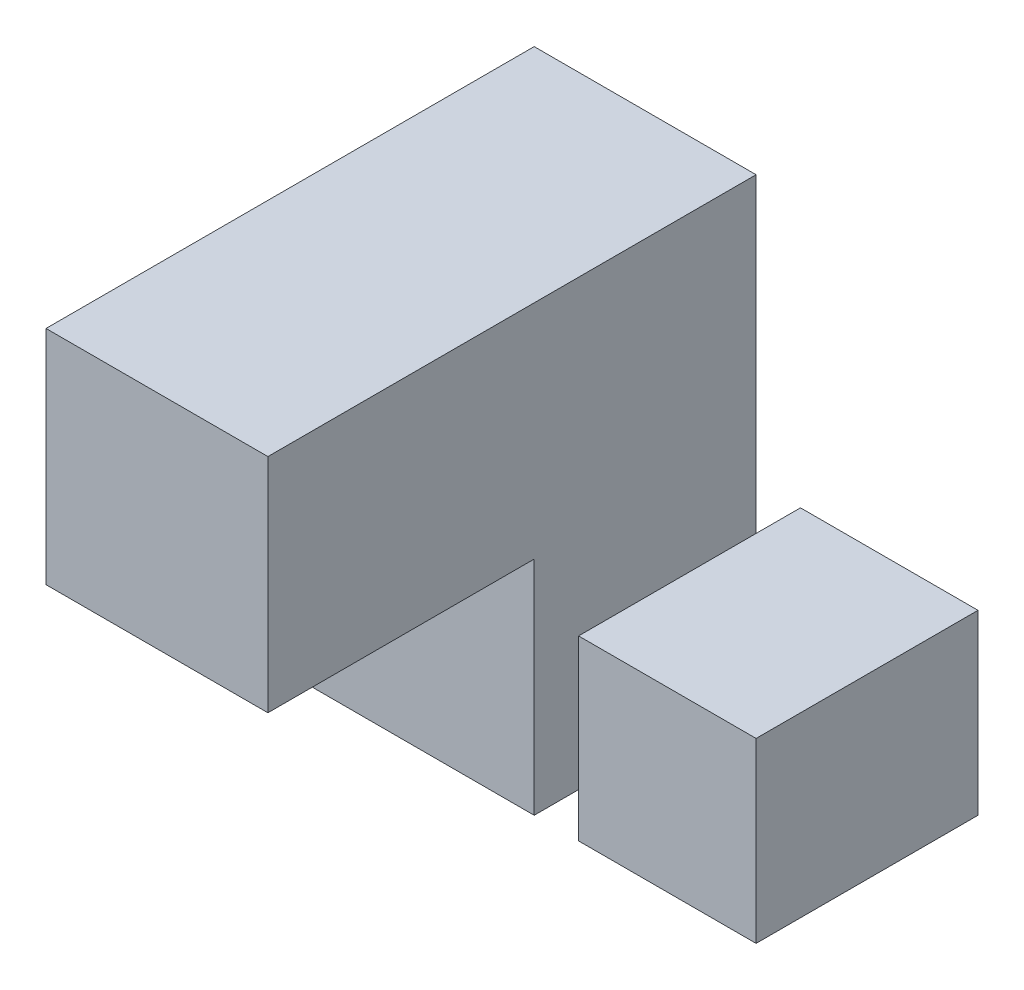
ISO-10303-21;
HEADER;
FILE_DESCRIPTION(('STEP AP214'),'2;1');
FILE_NAME('part.step','',(''),(''),'','','');
FILE_SCHEMA(('AUTOMOTIVE_DESIGN { 1 0 10303 214 1 1 1 1 }'));
ENDSEC;
DATA;
#1=APPLICATION_CONTEXT('core data for automotive mechanical design processes');
#2=APPLICATION_PROTOCOL_DEFINITION('international standard','automotive_design',2000,#1);
#3=PRODUCT_CONTEXT('',#1,'mechanical');
#4=PRODUCT('Part','Part','',(#3));
#5=PRODUCT_RELATED_PRODUCT_CATEGORY('part','',(#4));
#6=PRODUCT_DEFINITION_FORMATION('','',#4);
#7=PRODUCT_DEFINITION_CONTEXT('part definition',#1,'design');
#8=PRODUCT_DEFINITION('design','',#6,#7);
#9=PRODUCT_DEFINITION_SHAPE('','',#8);
#10=(LENGTH_UNIT() NAMED_UNIT(*) SI_UNIT(.MILLI.,.METRE.));
#11=(NAMED_UNIT(*) PLANE_ANGLE_UNIT() SI_UNIT($,.RADIAN.));
#12=(NAMED_UNIT(*) SI_UNIT($,.STERADIAN.) SOLID_ANGLE_UNIT());
#13=UNCERTAINTY_MEASURE_WITH_UNIT(LENGTH_MEASURE(1.E-05),#10,'distance_accuracy_value','');
#14=(GEOMETRIC_REPRESENTATION_CONTEXT(3) GLOBAL_UNCERTAINTY_ASSIGNED_CONTEXT((#13)) GLOBAL_UNIT_ASSIGNED_CONTEXT((#10,
#11,#12)) REPRESENTATION_CONTEXT('',''));
#15=CARTESIAN_POINT('',(0.,0.,0.));
#16=DIRECTION('',(0.,0.,1.));
#17=DIRECTION('',(1.,0.,0.));
#18=AXIS2_PLACEMENT_3D('',#15,#16,#17);
#19=CARTESIAN_POINT('',(12.,0.,10.));
#20=DIRECTION('',(1.,0.,0.));
#21=DIRECTION('',(0.,0.,-1.));
#22=AXIS2_PLACEMENT_3D('',#19,#20,#21);
#23=PLANE('',#22);
#24=DIRECTION('',(0.,-1.,0.));
#25=VECTOR('',#24,1.);
#26=CARTESIAN_POINT('',(12.,0.,0.));
#27=LINE('',#26,#25);
#28=CARTESIAN_POINT('',(12.,8.,0.));
#29=VERTEX_POINT('',#28);
#30=CARTESIAN_POINT('',(12.,0.,0.));
#31=VERTEX_POINT('',#30);
#32=EDGE_CURVE('E110',#29,#31,#27,.T.);
#33=ORIENTED_EDGE('',*,*,#32,.T.);
#34=DIRECTION('',(0.,0.,-1.));
#35=VECTOR('',#34,1.);
#36=CARTESIAN_POINT('',(12.,0.,10.));
#37=LINE('',#36,#35);
#38=CARTESIAN_POINT('',(12.,0.,10.));
#39=VERTEX_POINT('',#38);
#40=EDGE_CURVE('E12',#39,#31,#37,.T.);
#41=ORIENTED_EDGE('',*,*,#40,.F.);
#42=DIRECTION('',(0.,-1.,0.));
#43=VECTOR('',#42,1.);
#44=CARTESIAN_POINT('',(12.,0.,10.));
#45=LINE('',#44,#43);
#46=CARTESIAN_POINT('',(12.,8.,10.));
#47=VERTEX_POINT('',#46);
#48=EDGE_CURVE('E98',#47,#39,#45,.T.);
#49=ORIENTED_EDGE('',*,*,#48,.F.);
#50=DIRECTION('',(0.,0.,-1.));
#51=VECTOR('',#50,1.);
#52=CARTESIAN_POINT('',(12.,8.,10.));
#53=LINE('',#52,#51);
#54=EDGE_CURVE('E106',#47,#29,#53,.T.);
#55=ORIENTED_EDGE('',*,*,#54,.T.);
#56=EDGE_LOOP('',(#33,#41,#49,#55));
#57=FACE_BOUND('',#56,.T.);
#58=ADVANCED_FACE('F47',(#57),#23,.F.);
#59=CARTESIAN_POINT('',(12.,0.,10.));
#60=DIRECTION('',(0.,1.,0.));
#61=DIRECTION('',(0.,0.,1.));
#62=AXIS2_PLACEMENT_3D('',#59,#60,#61);
#63=PLANE('',#62);
#64=DIRECTION('',(1.,0.,0.));
#65=VECTOR('',#64,1.);
#66=CARTESIAN_POINT('',(12.,0.,0.));
#67=LINE('',#66,#65);
#68=CARTESIAN_POINT('',(20.,0.,0.));
#69=VERTEX_POINT('',#68);
#70=EDGE_CURVE('E102',#31,#69,#67,.T.);
#71=ORIENTED_EDGE('',*,*,#70,.T.);
#72=DIRECTION('',(0.,0.,-1.));
#73=VECTOR('',#72,1.);
#74=CARTESIAN_POINT('',(20.,0.,10.));
#75=LINE('',#74,#73);
#76=CARTESIAN_POINT('',(20.,0.,10.));
#77=VERTEX_POINT('',#76);
#78=EDGE_CURVE('E55',#77,#69,#75,.T.);
#79=ORIENTED_EDGE('',*,*,#78,.F.);
#80=DIRECTION('',(1.,0.,0.));
#81=VECTOR('',#80,1.);
#82=CARTESIAN_POINT('',(12.,0.,10.));
#83=LINE('',#82,#81);
#84=EDGE_CURVE('E93',#39,#77,#83,.T.);
#85=ORIENTED_EDGE('',*,*,#84,.F.);
#86=ORIENTED_EDGE('',*,*,#40,.T.);
#87=EDGE_LOOP('',(#71,#79,#85,#86));
#88=FACE_BOUND('',#87,.T.);
#89=ADVANCED_FACE('F101',(#88),#63,.F.);
#90=CARTESIAN_POINT('',(20.,0.,10.));
#91=DIRECTION('',(-1.,0.,0.));
#92=DIRECTION('',(0.,0.,1.));
#93=AXIS2_PLACEMENT_3D('',#90,#91,#92);
#94=PLANE('',#93);
#95=DIRECTION('',(0.,1.,0.));
#96=VECTOR('',#95,1.);
#97=CARTESIAN_POINT('',(20.,0.,0.));
#98=LINE('',#97,#96);
#99=CARTESIAN_POINT('',(20.,8.,0.));
#100=VERTEX_POINT('',#99);
#101=EDGE_CURVE('E80',#69,#100,#98,.T.);
#102=ORIENTED_EDGE('',*,*,#101,.T.);
#103=DIRECTION('',(0.,0.,-1.));
#104=VECTOR('',#103,1.);
#105=CARTESIAN_POINT('',(20.,8.,10.));
#106=LINE('',#105,#104);
#107=CARTESIAN_POINT('',(20.,8.,10.));
#108=VERTEX_POINT('',#107);
#109=EDGE_CURVE('E103',#108,#100,#106,.T.);
#110=ORIENTED_EDGE('',*,*,#109,.F.);
#111=DIRECTION('',(0.,1.,0.));
#112=VECTOR('',#111,1.);
#113=CARTESIAN_POINT('',(20.,0.,10.));
#114=LINE('',#113,#112);
#115=EDGE_CURVE('E96',#77,#108,#114,.T.);
#116=ORIENTED_EDGE('',*,*,#115,.F.);
#117=ORIENTED_EDGE('',*,*,#78,.T.);
#118=EDGE_LOOP('',(#102,#110,#116,#117));
#119=FACE_BOUND('',#118,.T.);
#120=ADVANCED_FACE('F104',(#119),#94,.F.);
#121=CARTESIAN_POINT('',(12.,8.,10.));
#122=DIRECTION('',(0.,-1.,0.));
#123=DIRECTION('',(0.,0.,-1.));
#124=AXIS2_PLACEMENT_3D('',#121,#122,#123);
#125=PLANE('',#124);
#126=DIRECTION('',(-1.,0.,0.));
#127=VECTOR('',#126,1.);
#128=CARTESIAN_POINT('',(12.,8.,0.));
#129=LINE('',#128,#127);
#130=EDGE_CURVE('E86',#100,#29,#129,.T.);
#131=ORIENTED_EDGE('',*,*,#130,.T.);
#132=ORIENTED_EDGE('',*,*,#54,.F.);
#133=DIRECTION('',(-1.,0.,0.));
#134=VECTOR('',#133,1.);
#135=CARTESIAN_POINT('',(12.,8.,10.));
#136=LINE('',#135,#134);
#137=EDGE_CURVE('E63',#108,#47,#136,.T.);
#138=ORIENTED_EDGE('',*,*,#137,.F.);
#139=ORIENTED_EDGE('',*,*,#109,.T.);
#140=EDGE_LOOP('',(#131,#132,#138,#139));
#141=FACE_BOUND('',#140,.T.);
#142=ADVANCED_FACE('F117',(#141),#125,.F.);
#143=CARTESIAN_POINT('',(0.,0.,10.));
#144=DIRECTION('',(0.,0.,-1.));
#145=DIRECTION('',(-1.,0.,0.));
#146=AXIS2_PLACEMENT_3D('',#143,#144,#145);
#147=PLANE('',#146);
#148=ORIENTED_EDGE('',*,*,#48,.T.);
#149=ORIENTED_EDGE('',*,*,#84,.T.);
#150=ORIENTED_EDGE('',*,*,#115,.T.);
#151=ORIENTED_EDGE('',*,*,#137,.T.);
#152=EDGE_LOOP('',(#148,#149,#150,#151));
#153=FACE_BOUND('',#152,.T.);
#154=ADVANCED_FACE('F94',(#153),#147,.F.);
#155=CARTESIAN_POINT('',(0.,0.,0.));
#156=DIRECTION('',(0.,0.,-1.));
#157=DIRECTION('',(-1.,0.,0.));
#158=AXIS2_PLACEMENT_3D('',#155,#156,#157);
#159=PLANE('',#158);
#160=ORIENTED_EDGE('',*,*,#32,.F.);
#161=ORIENTED_EDGE('',*,*,#130,.F.);
#162=ORIENTED_EDGE('',*,*,#101,.F.);
#163=ORIENTED_EDGE('',*,*,#70,.F.);
#164=EDGE_LOOP('',(#160,#161,#162,#163));
#165=FACE_BOUND('',#164,.T.);
#166=ADVANCED_FACE('F120',(#165),#159,.T.);
#167=CLOSED_SHELL('',(#58,#89,#120,#142,#154,#166));
#168=MANIFOLD_SOLID_BREP('B2',#167);
#169=CARTESIAN_POINT('',(0.,0.,10.));
#170=DIRECTION('',(0.,0.,-1.));
#171=DIRECTION('',(-1.,0.,0.));
#172=AXIS2_PLACEMENT_3D('',#169,#170,#171);
#173=PLANE('',#172);
#174=DIRECTION('',(1.,0.,0.));
#175=VECTOR('',#174,1.);
#176=CARTESIAN_POINT('',(0.,10.,10.));
#177=LINE('',#176,#175);
#178=CARTESIAN_POINT('',(0.,10.,10.));
#179=VERTEX_POINT('',#178);
#180=CARTESIAN_POINT('',(10.,10.,10.));
#181=VERTEX_POINT('',#180);
#182=EDGE_CURVE('E190',#179,#181,#177,.T.);
#183=ORIENTED_EDGE('',*,*,#182,.F.);
#184=DIRECTION('',(0.,-1.,0.));
#185=VECTOR('',#184,1.);
#186=CARTESIAN_POINT('',(0.,0.,10.));
#187=LINE('',#186,#185);
#188=CARTESIAN_POINT('',(0.,0.,10.));
#189=VERTEX_POINT('',#188);
#190=EDGE_CURVE('E244',#179,#189,#187,.T.);
#191=ORIENTED_EDGE('',*,*,#190,.T.);
#192=DIRECTION('',(1.,0.,0.));
#193=VECTOR('',#192,1.);
#194=CARTESIAN_POINT('',(0.,0.,10.));
#195=LINE('',#194,#193);
#196=CARTESIAN_POINT('',(10.,0.,10.));
#197=VERTEX_POINT('',#196);
#198=EDGE_CURVE('E252',#189,#197,#195,.T.);
#199=ORIENTED_EDGE('',*,*,#198,.T.);
#200=DIRECTION('',(0.,1.,0.));
#201=VECTOR('',#200,1.);
#202=CARTESIAN_POINT('',(10.,0.,10.));
#203=LINE('',#202,#201);
#204=EDGE_CURVE('E186',#197,#181,#203,.T.);
#205=ORIENTED_EDGE('',*,*,#204,.T.);
#206=EDGE_LOOP('',(#183,#191,#199,#205));
#207=FACE_BOUND('',#206,.T.);
#208=ADVANCED_FACE('F171',(#207),#173,.F.);
#209=CARTESIAN_POINT('',(0.,0.,10.));
#210=DIRECTION('',(1.,0.,0.));
#211=DIRECTION('',(0.,0.,-1.));
#212=AXIS2_PLACEMENT_3D('',#209,#210,#211);
#213=PLANE('',#212);
#214=DIRECTION('',(0.,-1.,0.));
#215=VECTOR('',#214,1.);
#216=CARTESIAN_POINT('',(0.,0.,0.));
#217=LINE('',#216,#215);
#218=CARTESIAN_POINT('',(0.,20.,0.));
#219=VERTEX_POINT('',#218);
#220=CARTESIAN_POINT('',(0.,0.,0.));
#221=VERTEX_POINT('',#220);
#222=EDGE_CURVE('E246',#219,#221,#217,.T.);
#223=ORIENTED_EDGE('',*,*,#222,.T.);
#224=DIRECTION('',(0.,0.,-1.));
#225=VECTOR('',#224,1.);
#226=CARTESIAN_POINT('',(0.,0.,10.));
#227=LINE('',#226,#225);
#228=EDGE_CURVE('E45',#189,#221,#227,.T.);
#229=ORIENTED_EDGE('',*,*,#228,.F.);
#230=ORIENTED_EDGE('',*,*,#190,.F.);
#231=DIRECTION('',(0.,0.,-1.));
#232=VECTOR('',#231,1.);
#233=CARTESIAN_POINT('',(0.,10.,22.));
#234=LINE('',#233,#232);
#235=CARTESIAN_POINT('',(0.,10.,22.));
#236=VERTEX_POINT('',#235);
#237=EDGE_CURVE('E226',#236,#179,#234,.T.);
#238=ORIENTED_EDGE('',*,*,#237,.F.);
#239=DIRECTION('',(0.,-1.,0.));
#240=VECTOR('',#239,1.);
#241=CARTESIAN_POINT('',(0.,10.,22.));
#242=LINE('',#241,#240);
#243=CARTESIAN_POINT('',(0.,20.,22.));
#244=VERTEX_POINT('',#243);
#245=EDGE_CURVE('E233',#244,#236,#242,.T.);
#246=ORIENTED_EDGE('',*,*,#245,.F.);
#247=DIRECTION('',(0.,0.,-1.));
#248=VECTOR('',#247,1.);
#249=CARTESIAN_POINT('',(0.,20.,10.));
#250=LINE('',#249,#248);
#251=EDGE_CURVE('E256',#244,#219,#250,.T.);
#252=ORIENTED_EDGE('',*,*,#251,.T.);
#253=EDGE_LOOP('',(#223,#229,#230,#238,#246,#252));
#254=FACE_BOUND('',#253,.T.);
#255=ADVANCED_FACE('F173',(#254),#213,.F.);
#256=CARTESIAN_POINT('',(0.,0.,10.));
#257=DIRECTION('',(0.,1.,0.));
#258=DIRECTION('',(0.,0.,1.));
#259=AXIS2_PLACEMENT_3D('',#256,#257,#258);
#260=PLANE('',#259);
#261=DIRECTION('',(1.,0.,0.));
#262=VECTOR('',#261,1.);
#263=CARTESIAN_POINT('',(0.,0.,0.));
#264=LINE('',#263,#262);
#265=CARTESIAN_POINT('',(10.,0.,0.));
#266=VERTEX_POINT('',#265);
#267=EDGE_CURVE('E258',#221,#266,#264,.T.);
#268=ORIENTED_EDGE('',*,*,#267,.T.);
#269=DIRECTION('',(0.,0.,-1.));
#270=VECTOR('',#269,1.);
#271=CARTESIAN_POINT('',(10.,0.,10.));
#272=LINE('',#271,#270);
#273=EDGE_CURVE('E179',#197,#266,#272,.T.);
#274=ORIENTED_EDGE('',*,*,#273,.F.);
#275=ORIENTED_EDGE('',*,*,#198,.F.);
#276=ORIENTED_EDGE('',*,*,#228,.T.);
#277=EDGE_LOOP('',(#268,#274,#275,#276));
#278=FACE_BOUND('',#277,.T.);
#279=ADVANCED_FACE('F280',(#278),#260,.F.);
#280=CARTESIAN_POINT('',(10.,0.,10.));
#281=DIRECTION('',(-1.,0.,0.));
#282=DIRECTION('',(0.,0.,1.));
#283=AXIS2_PLACEMENT_3D('',#280,#281,#282);
#284=PLANE('',#283);
#285=DIRECTION('',(0.,0.,-1.));
#286=VECTOR('',#285,1.);
#287=CARTESIAN_POINT('',(10.,20.,10.));
#288=LINE('',#287,#286);
#289=CARTESIAN_POINT('',(10.,20.,22.));
#290=VERTEX_POINT('',#289);
#291=CARTESIAN_POINT('',(10.,20.,0.));
#292=VERTEX_POINT('',#291);
#293=EDGE_CURVE('E264',#290,#292,#288,.T.);
#294=ORIENTED_EDGE('',*,*,#293,.F.);
#295=DIRECTION('',(0.,1.,0.));
#296=VECTOR('',#295,1.);
#297=CARTESIAN_POINT('',(10.,10.,22.));
#298=LINE('',#297,#296);
#299=CARTESIAN_POINT('',(10.,10.,22.));
#300=VERTEX_POINT('',#299);
#301=EDGE_CURVE('E232',#300,#290,#298,.T.);
#302=ORIENTED_EDGE('',*,*,#301,.F.);
#303=DIRECTION('',(0.,0.,-1.));
#304=VECTOR('',#303,1.);
#305=CARTESIAN_POINT('',(10.,10.,22.));
#306=LINE('',#305,#304);
#307=EDGE_CURVE('E228',#300,#181,#306,.T.);
#308=ORIENTED_EDGE('',*,*,#307,.T.);
#309=ORIENTED_EDGE('',*,*,#204,.F.);
#310=ORIENTED_EDGE('',*,*,#273,.T.);
#311=DIRECTION('',(0.,1.,0.));
#312=VECTOR('',#311,1.);
#313=CARTESIAN_POINT('',(10.,0.,0.));
#314=LINE('',#313,#312);
#315=EDGE_CURVE('E260',#266,#292,#314,.T.);
#316=ORIENTED_EDGE('',*,*,#315,.T.);
#317=EDGE_LOOP('',(#294,#302,#308,#309,#310,#316));
#318=FACE_BOUND('',#317,.T.);
#319=ADVANCED_FACE('F270',(#318),#284,.F.);
#320=CARTESIAN_POINT('',(0.,20.,10.));
#321=DIRECTION('',(0.,-1.,0.));
#322=DIRECTION('',(0.,0.,-1.));
#323=AXIS2_PLACEMENT_3D('',#320,#321,#322);
#324=PLANE('',#323);
#325=DIRECTION('',(-1.,0.,0.));
#326=VECTOR('',#325,1.);
#327=CARTESIAN_POINT('',(0.,20.,0.));
#328=LINE('',#327,#326);
#329=EDGE_CURVE('E253',#292,#219,#328,.T.);
#330=ORIENTED_EDGE('',*,*,#329,.T.);
#331=ORIENTED_EDGE('',*,*,#251,.F.);
#332=DIRECTION('',(-1.,0.,0.));
#333=VECTOR('',#332,1.);
#334=CARTESIAN_POINT('',(0.,20.,22.));
#335=LINE('',#334,#333);
#336=EDGE_CURVE('E239',#290,#244,#335,.T.);
#337=ORIENTED_EDGE('',*,*,#336,.F.);
#338=ORIENTED_EDGE('',*,*,#293,.T.);
#339=EDGE_LOOP('',(#330,#331,#337,#338));
#340=FACE_BOUND('',#339,.T.);
#341=ADVANCED_FACE('F279',(#340),#324,.F.);
#342=CARTESIAN_POINT('',(0.,0.,0.));
#343=DIRECTION('',(0.,0.,-1.));
#344=DIRECTION('',(-1.,0.,0.));
#345=AXIS2_PLACEMENT_3D('',#342,#343,#344);
#346=PLANE('',#345);
#347=ORIENTED_EDGE('',*,*,#329,.F.);
#348=ORIENTED_EDGE('',*,*,#315,.F.);
#349=ORIENTED_EDGE('',*,*,#267,.F.);
#350=ORIENTED_EDGE('',*,*,#222,.F.);
#351=EDGE_LOOP('',(#347,#348,#349,#350));
#352=FACE_BOUND('',#351,.T.);
#353=ADVANCED_FACE('F276',(#352),#346,.T.);
#354=CARTESIAN_POINT('',(0.,10.,22.));
#355=DIRECTION('',(0.,1.,0.));
#356=DIRECTION('',(0.,0.,1.));
#357=AXIS2_PLACEMENT_3D('',#354,#355,#356);
#358=PLANE('',#357);
#359=ORIENTED_EDGE('',*,*,#237,.T.);
#360=ORIENTED_EDGE('',*,*,#182,.T.);
#361=ORIENTED_EDGE('',*,*,#307,.F.);
#362=DIRECTION('',(1.,0.,0.));
#363=VECTOR('',#362,1.);
#364=CARTESIAN_POINT('',(0.,10.,22.));
#365=LINE('',#364,#363);
#366=EDGE_CURVE('E222',#236,#300,#365,.T.);
#367=ORIENTED_EDGE('',*,*,#366,.F.);
#368=EDGE_LOOP('',(#359,#360,#361,#367));
#369=FACE_BOUND('',#368,.T.);
#370=ADVANCED_FACE('F224',(#369),#358,.F.);
#371=CARTESIAN_POINT('',(0.,0.,22.));
#372=DIRECTION('',(0.,0.,-1.));
#373=DIRECTION('',(-1.,0.,0.));
#374=AXIS2_PLACEMENT_3D('',#371,#372,#373);
#375=PLANE('',#374);
#376=ORIENTED_EDGE('',*,*,#245,.T.);
#377=ORIENTED_EDGE('',*,*,#366,.T.);
#378=ORIENTED_EDGE('',*,*,#301,.T.);
#379=ORIENTED_EDGE('',*,*,#336,.T.);
#380=EDGE_LOOP('',(#376,#377,#378,#379));
#381=FACE_BOUND('',#380,.T.);
#382=ADVANCED_FACE('F237',(#381),#375,.F.);
#383=CLOSED_SHELL('',(#208,#255,#279,#319,#341,#353,#370,#382));
#384=MANIFOLD_SOLID_BREP('B6',#383);
#385=ADVANCED_BREP_SHAPE_REPRESENTATION('',(#18,#168,#384),#14);
#386=SHAPE_DEFINITION_REPRESENTATION(#9,#385);
ENDSEC;
END-ISO-10303-21;
